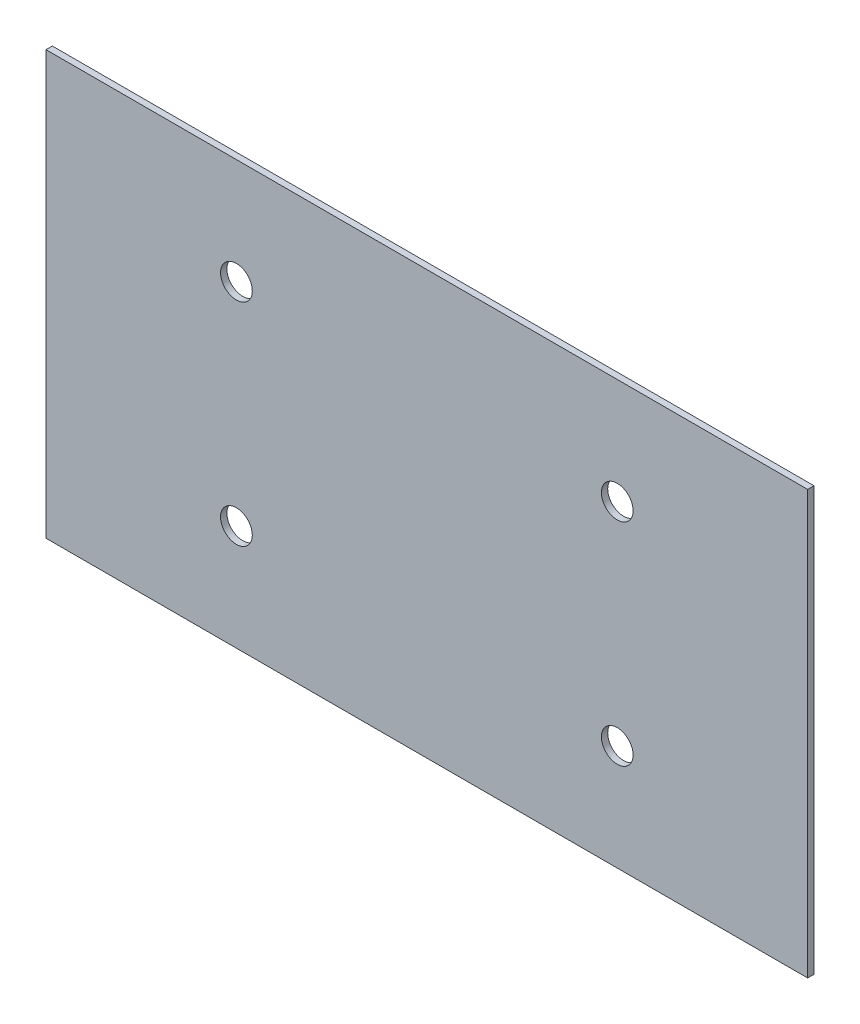
ISO-10303-21;
HEADER;
FILE_DESCRIPTION(('STEP AP214'),'2;1');
FILE_NAME('part.step','',(''),(''),'','','');
FILE_SCHEMA(('AUTOMOTIVE_DESIGN { 1 0 10303 214 1 1 1 1 }'));
ENDSEC;
DATA;
#1=APPLICATION_CONTEXT('core data for automotive mechanical design processes');
#2=APPLICATION_PROTOCOL_DEFINITION('international standard','automotive_design',2000,#1);
#3=PRODUCT_CONTEXT('',#1,'mechanical');
#4=PRODUCT('Part','Part','',(#3));
#5=PRODUCT_RELATED_PRODUCT_CATEGORY('part','',(#4));
#6=PRODUCT_DEFINITION_FORMATION('','',#4);
#7=PRODUCT_DEFINITION_CONTEXT('part definition',#1,'design');
#8=PRODUCT_DEFINITION('design','',#6,#7);
#9=PRODUCT_DEFINITION_SHAPE('','',#8);
#10=(LENGTH_UNIT() NAMED_UNIT(*) SI_UNIT(.MILLI.,.METRE.));
#11=(NAMED_UNIT(*) PLANE_ANGLE_UNIT() SI_UNIT($,.RADIAN.));
#12=(NAMED_UNIT(*) SI_UNIT($,.STERADIAN.) SOLID_ANGLE_UNIT());
#13=UNCERTAINTY_MEASURE_WITH_UNIT(LENGTH_MEASURE(1.E-05),#10,'distance_accuracy_value','');
#14=(GEOMETRIC_REPRESENTATION_CONTEXT(3) GLOBAL_UNCERTAINTY_ASSIGNED_CONTEXT((#13)) GLOBAL_UNIT_ASSIGNED_CONTEXT((#10,
#11,#12)) REPRESENTATION_CONTEXT('',''));
#15=CARTESIAN_POINT('',(0.,0.,0.));
#16=DIRECTION('',(0.,0.,1.));
#17=DIRECTION('',(1.,0.,0.));
#18=AXIS2_PLACEMENT_3D('',#15,#16,#17);
#19=CARTESIAN_POINT('',(180.,100.,3.));
#20=DIRECTION('',(-1.,0.,0.));
#21=DIRECTION('',(0.,-1.,0.));
#22=AXIS2_PLACEMENT_3D('',#19,#20,#21);
#23=PLANE('',#22);
#24=DIRECTION('',(0.,1.,0.));
#25=VECTOR('',#24,1.);
#26=CARTESIAN_POINT('',(180.,100.,0.));
#27=LINE('',#26,#25);
#28=CARTESIAN_POINT('',(180.,-100.,0.));
#29=VERTEX_POINT('',#28);
#30=CARTESIAN_POINT('',(180.,100.,0.));
#31=VERTEX_POINT('',#30);
#32=EDGE_CURVE('E102',#29,#31,#27,.T.);
#33=ORIENTED_EDGE('',*,*,#32,.T.);
#34=DIRECTION('',(0.,0.,-1.));
#35=VECTOR('',#34,1.);
#36=CARTESIAN_POINT('',(180.,100.,3.));
#37=LINE('',#36,#35);
#38=CARTESIAN_POINT('',(180.,100.,3.));
#39=VERTEX_POINT('',#38);
#40=EDGE_CURVE('E11',#39,#31,#37,.T.);
#41=ORIENTED_EDGE('',*,*,#40,.F.);
#42=DIRECTION('',(0.,1.,0.));
#43=VECTOR('',#42,1.);
#44=CARTESIAN_POINT('',(180.,100.,3.));
#45=LINE('',#44,#43);
#46=CARTESIAN_POINT('',(180.,-100.,3.));
#47=VERTEX_POINT('',#46);
#48=EDGE_CURVE('E90',#47,#39,#45,.T.);
#49=ORIENTED_EDGE('',*,*,#48,.F.);
#50=DIRECTION('',(0.,0.,-1.));
#51=VECTOR('',#50,1.);
#52=CARTESIAN_POINT('',(180.,-100.,3.));
#53=LINE('',#52,#51);
#54=EDGE_CURVE('E98',#47,#29,#53,.T.);
#55=ORIENTED_EDGE('',*,*,#54,.T.);
#56=EDGE_LOOP('',(#33,#41,#49,#55));
#57=FACE_BOUND('',#56,.T.);
#58=ADVANCED_FACE('F39',(#57),#23,.F.);
#59=CARTESIAN_POINT('',(-180.,100.,3.));
#60=DIRECTION('',(0.,-1.,0.));
#61=DIRECTION('',(0.,0.,-1.));
#62=AXIS2_PLACEMENT_3D('',#59,#60,#61);
#63=PLANE('',#62);
#64=DIRECTION('',(-1.,0.,0.));
#65=VECTOR('',#64,1.);
#66=CARTESIAN_POINT('',(-180.,100.,0.));
#67=LINE('',#66,#65);
#68=CARTESIAN_POINT('',(-180.,100.,0.));
#69=VERTEX_POINT('',#68);
#70=EDGE_CURVE('E94',#31,#69,#67,.T.);
#71=ORIENTED_EDGE('',*,*,#70,.T.);
#72=DIRECTION('',(0.,0.,-1.));
#73=VECTOR('',#72,1.);
#74=CARTESIAN_POINT('',(-180.,100.,3.));
#75=LINE('',#74,#73);
#76=CARTESIAN_POINT('',(-180.,100.,3.));
#77=VERTEX_POINT('',#76);
#78=EDGE_CURVE('E47',#77,#69,#75,.T.);
#79=ORIENTED_EDGE('',*,*,#78,.F.);
#80=DIRECTION('',(-1.,0.,0.));
#81=VECTOR('',#80,1.);
#82=CARTESIAN_POINT('',(-180.,100.,3.));
#83=LINE('',#82,#81);
#84=EDGE_CURVE('E85',#39,#77,#83,.T.);
#85=ORIENTED_EDGE('',*,*,#84,.F.);
#86=ORIENTED_EDGE('',*,*,#40,.T.);
#87=EDGE_LOOP('',(#71,#79,#85,#86));
#88=FACE_BOUND('',#87,.T.);
#89=ADVANCED_FACE('F93',(#88),#63,.F.);
#90=CARTESIAN_POINT('',(-180.,100.,3.));
#91=DIRECTION('',(1.,0.,0.));
#92=DIRECTION('',(0.,1.,0.));
#93=AXIS2_PLACEMENT_3D('',#90,#91,#92);
#94=PLANE('',#93);
#95=DIRECTION('',(0.,-1.,0.));
#96=VECTOR('',#95,1.);
#97=CARTESIAN_POINT('',(-180.,100.,0.));
#98=LINE('',#97,#96);
#99=CARTESIAN_POINT('',(-180.,-100.,0.));
#100=VERTEX_POINT('',#99);
#101=EDGE_CURVE('E72',#69,#100,#98,.T.);
#102=ORIENTED_EDGE('',*,*,#101,.T.);
#103=DIRECTION('',(0.,0.,-1.));
#104=VECTOR('',#103,1.);
#105=CARTESIAN_POINT('',(-180.,-100.,3.));
#106=LINE('',#105,#104);
#107=CARTESIAN_POINT('',(-180.,-100.,3.));
#108=VERTEX_POINT('',#107);
#109=EDGE_CURVE('E95',#108,#100,#106,.T.);
#110=ORIENTED_EDGE('',*,*,#109,.F.);
#111=DIRECTION('',(0.,-1.,0.));
#112=VECTOR('',#111,1.);
#113=CARTESIAN_POINT('',(-180.,100.,3.));
#114=LINE('',#113,#112);
#115=EDGE_CURVE('E88',#77,#108,#114,.T.);
#116=ORIENTED_EDGE('',*,*,#115,.F.);
#117=ORIENTED_EDGE('',*,*,#78,.T.);
#118=EDGE_LOOP('',(#102,#110,#116,#117));
#119=FACE_BOUND('',#118,.T.);
#120=ADVANCED_FACE('F96',(#119),#94,.F.);
#121=CARTESIAN_POINT('',(-180.,-100.,3.));
#122=DIRECTION('',(0.,1.,0.));
#123=DIRECTION('',(0.,0.,1.));
#124=AXIS2_PLACEMENT_3D('',#121,#122,#123);
#125=PLANE('',#124);
#126=DIRECTION('',(1.,0.,0.));
#127=VECTOR('',#126,1.);
#128=CARTESIAN_POINT('',(-180.,-100.,0.));
#129=LINE('',#128,#127);
#130=EDGE_CURVE('E78',#100,#29,#129,.T.);
#131=ORIENTED_EDGE('',*,*,#130,.T.);
#132=ORIENTED_EDGE('',*,*,#54,.F.);
#133=DIRECTION('',(1.,0.,0.));
#134=VECTOR('',#133,1.);
#135=CARTESIAN_POINT('',(-180.,-100.,3.));
#136=LINE('',#135,#134);
#137=EDGE_CURVE('E55',#108,#47,#136,.T.);
#138=ORIENTED_EDGE('',*,*,#137,.F.);
#139=ORIENTED_EDGE('',*,*,#109,.T.);
#140=EDGE_LOOP('',(#131,#132,#138,#139));
#141=FACE_BOUND('',#140,.T.);
#142=ADVANCED_FACE('F110',(#141),#125,.F.);
#143=CARTESIAN_POINT('',(0.,0.,3.));
#144=DIRECTION('',(0.,0.,1.));
#145=DIRECTION('',(1.,0.,0.));
#146=AXIS2_PLACEMENT_3D('',#143,#144,#145);
#147=PLANE('',#146);
#148=CARTESIAN_POINT('',(90.,-50.,3.));
#149=DIRECTION('',(0.,0.,1.));
#150=DIRECTION('',(1.,0.,0.));
#151=AXIS2_PLACEMENT_3D('',#148,#149,#150);
#152=CIRCLE('',#151,7.5);
#153=CARTESIAN_POINT('',(97.4999999999999,-50.,3.));
#154=VERTEX_POINT('',#153);
#155=EDGE_CURVE('E105',#154,#154,#152,.T.);
#156=ORIENTED_EDGE('',*,*,#155,.F.);
#157=EDGE_LOOP('',(#156));
#158=FACE_BOUND('',#157,.T.);
#159=CARTESIAN_POINT('',(-90.,-50.,3.));
#160=DIRECTION('',(0.,0.,1.));
#161=DIRECTION('',(1.,0.,0.));
#162=AXIS2_PLACEMENT_3D('',#159,#160,#161);
#163=CIRCLE('',#162,7.50000000000001);
#164=CARTESIAN_POINT('',(-82.5,-50.,3.));
#165=VERTEX_POINT('',#164);
#166=EDGE_CURVE('E118',#165,#165,#163,.T.);
#167=ORIENTED_EDGE('',*,*,#166,.F.);
#168=EDGE_LOOP('',(#167));
#169=FACE_BOUND('',#168,.T.);
#170=CARTESIAN_POINT('',(-90.,50.,3.));
#171=DIRECTION('',(0.,0.,1.));
#172=DIRECTION('',(1.,0.,0.));
#173=AXIS2_PLACEMENT_3D('',#170,#171,#172);
#174=CIRCLE('',#173,7.50000000000001);
#175=CARTESIAN_POINT('',(-82.5,50.,3.));
#176=VERTEX_POINT('',#175);
#177=EDGE_CURVE('E121',#176,#176,#174,.T.);
#178=ORIENTED_EDGE('',*,*,#177,.F.);
#179=EDGE_LOOP('',(#178));
#180=FACE_BOUND('',#179,.T.);
#181=CARTESIAN_POINT('',(90.,50.,3.));
#182=DIRECTION('',(0.,0.,1.));
#183=DIRECTION('',(1.,0.,0.));
#184=AXIS2_PLACEMENT_3D('',#181,#182,#183);
#185=CIRCLE('',#184,7.50000000000001);
#186=CARTESIAN_POINT('',(97.5,50.,3.));
#187=VERTEX_POINT('',#186);
#188=EDGE_CURVE('E124',#187,#187,#185,.T.);
#189=ORIENTED_EDGE('',*,*,#188,.F.);
#190=EDGE_LOOP('',(#189));
#191=FACE_BOUND('',#190,.T.);
#192=ORIENTED_EDGE('',*,*,#48,.T.);
#193=ORIENTED_EDGE('',*,*,#84,.T.);
#194=ORIENTED_EDGE('',*,*,#115,.T.);
#195=ORIENTED_EDGE('',*,*,#137,.T.);
#196=EDGE_LOOP('',(#192,#193,#194,#195));
#197=FACE_BOUND('',#196,.T.);
#198=ADVANCED_FACE('F86',(#158,#169,#180,#191,#197),#147,.T.);
#199=CARTESIAN_POINT('',(0.,0.,0.));
#200=DIRECTION('',(0.,0.,1.));
#201=DIRECTION('',(1.,0.,0.));
#202=AXIS2_PLACEMENT_3D('',#199,#200,#201);
#203=PLANE('',#202);
#204=CARTESIAN_POINT('',(90.,-50.,0.));
#205=DIRECTION('',(0.,0.,-1.));
#206=DIRECTION('',(-1.,0.,0.));
#207=AXIS2_PLACEMENT_3D('',#204,#205,#206);
#208=CIRCLE('',#207,7.5);
#209=CARTESIAN_POINT('',(82.5,-50.,0.));
#210=VERTEX_POINT('',#209);
#211=EDGE_CURVE('E131',#210,#210,#208,.T.);
#212=ORIENTED_EDGE('',*,*,#211,.F.);
#213=EDGE_LOOP('',(#212));
#214=FACE_BOUND('',#213,.T.);
#215=CARTESIAN_POINT('',(-90.,-50.,0.));
#216=DIRECTION('',(0.,0.,-1.));
#217=DIRECTION('',(-1.,0.,0.));
#218=AXIS2_PLACEMENT_3D('',#215,#216,#217);
#219=CIRCLE('',#218,7.50000000000001);
#220=CARTESIAN_POINT('',(-97.5,-50.,0.));
#221=VERTEX_POINT('',#220);
#222=EDGE_CURVE('E134',#221,#221,#219,.T.);
#223=ORIENTED_EDGE('',*,*,#222,.F.);
#224=EDGE_LOOP('',(#223));
#225=FACE_BOUND('',#224,.T.);
#226=CARTESIAN_POINT('',(-90.,50.,0.));
#227=DIRECTION('',(0.,0.,-1.));
#228=DIRECTION('',(-1.,0.,0.));
#229=AXIS2_PLACEMENT_3D('',#226,#227,#228);
#230=CIRCLE('',#229,7.50000000000001);
#231=CARTESIAN_POINT('',(-97.5,50.,0.));
#232=VERTEX_POINT('',#231);
#233=EDGE_CURVE('E130',#232,#232,#230,.T.);
#234=ORIENTED_EDGE('',*,*,#233,.F.);
#235=EDGE_LOOP('',(#234));
#236=FACE_BOUND('',#235,.T.);
#237=CARTESIAN_POINT('',(90.,50.,0.));
#238=DIRECTION('',(0.,0.,-1.));
#239=DIRECTION('',(-1.,0.,0.));
#240=AXIS2_PLACEMENT_3D('',#237,#238,#239);
#241=CIRCLE('',#240,7.50000000000001);
#242=CARTESIAN_POINT('',(82.5,50.,0.));
#243=VERTEX_POINT('',#242);
#244=EDGE_CURVE('E127',#243,#243,#241,.T.);
#245=ORIENTED_EDGE('',*,*,#244,.F.);
#246=EDGE_LOOP('',(#245));
#247=FACE_BOUND('',#246,.T.);
#248=ORIENTED_EDGE('',*,*,#32,.F.);
#249=ORIENTED_EDGE('',*,*,#130,.F.);
#250=ORIENTED_EDGE('',*,*,#101,.F.);
#251=ORIENTED_EDGE('',*,*,#70,.F.);
#252=EDGE_LOOP('',(#248,#249,#250,#251));
#253=FACE_BOUND('',#252,.T.);
#254=ADVANCED_FACE('F113',(#214,#225,#236,#247,#253),#203,.F.);
#255=CARTESIAN_POINT('',(90.,50.,10.));
#256=DIRECTION('',(0.,0.,-1.));
#257=DIRECTION('',(-1.,0.,0.));
#258=AXIS2_PLACEMENT_3D('',#255,#256,#257);
#259=CYLINDRICAL_SURFACE('',#258,7.50000000000001);
#260=ORIENTED_EDGE('',*,*,#188,.T.);
#261=EDGE_LOOP('',(#260));
#262=FACE_BOUND('',#261,.T.);
#263=ORIENTED_EDGE('',*,*,#244,.T.);
#264=EDGE_LOOP('',(#263));
#265=FACE_BOUND('',#264,.T.);
#266=ADVANCED_FACE('F144',(#262,#265),#259,.F.);
#267=CARTESIAN_POINT('',(-90.,50.,10.));
#268=DIRECTION('',(0.,0.,-1.));
#269=DIRECTION('',(-1.,0.,0.));
#270=AXIS2_PLACEMENT_3D('',#267,#268,#269);
#271=CYLINDRICAL_SURFACE('',#270,7.50000000000001);
#272=ORIENTED_EDGE('',*,*,#177,.T.);
#273=EDGE_LOOP('',(#272));
#274=FACE_BOUND('',#273,.T.);
#275=ORIENTED_EDGE('',*,*,#233,.T.);
#276=EDGE_LOOP('',(#275));
#277=FACE_BOUND('',#276,.T.);
#278=ADVANCED_FACE('F140',(#274,#277),#271,.F.);
#279=CARTESIAN_POINT('',(-90.,-50.,10.));
#280=DIRECTION('',(0.,0.,-1.));
#281=DIRECTION('',(-1.,0.,0.));
#282=AXIS2_PLACEMENT_3D('',#279,#280,#281);
#283=CYLINDRICAL_SURFACE('',#282,7.50000000000001);
#284=ORIENTED_EDGE('',*,*,#166,.T.);
#285=EDGE_LOOP('',(#284));
#286=FACE_BOUND('',#285,.T.);
#287=ORIENTED_EDGE('',*,*,#222,.T.);
#288=EDGE_LOOP('',(#287));
#289=FACE_BOUND('',#288,.T.);
#290=ADVANCED_FACE('F155',(#286,#289),#283,.F.);
#291=CARTESIAN_POINT('',(90.,-50.,10.));
#292=DIRECTION('',(0.,0.,-1.));
#293=DIRECTION('',(-1.,0.,0.));
#294=AXIS2_PLACEMENT_3D('',#291,#292,#293);
#295=CYLINDRICAL_SURFACE('',#294,7.5);
#296=ORIENTED_EDGE('',*,*,#155,.T.);
#297=EDGE_LOOP('',(#296));
#298=FACE_BOUND('',#297,.T.);
#299=ORIENTED_EDGE('',*,*,#211,.T.);
#300=EDGE_LOOP('',(#299));
#301=FACE_BOUND('',#300,.T.);
#302=ADVANCED_FACE('F184',(#298,#301),#295,.F.);
#303=CLOSED_SHELL('',(#58,#89,#120,#142,#198,#254,#266,#278,#290,#302));
#304=MANIFOLD_SOLID_BREP('B2',#303);
#305=ADVANCED_BREP_SHAPE_REPRESENTATION('',(#18,#304),#14);
#306=SHAPE_DEFINITION_REPRESENTATION(#9,#305);
ENDSEC;
END-ISO-10303-21;
